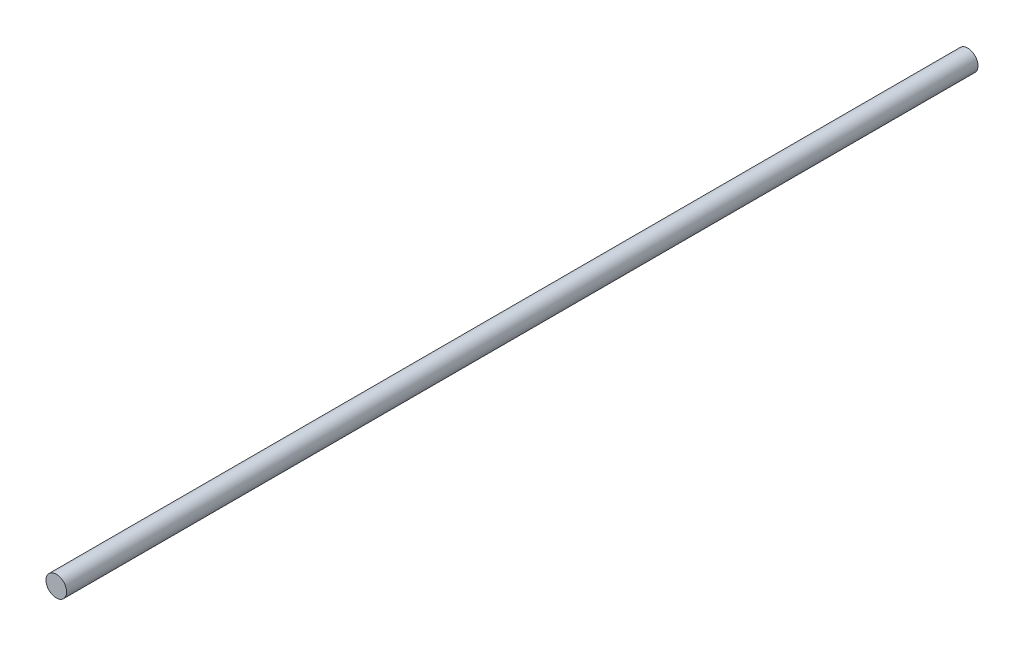
ISO-10303-21;
HEADER;
FILE_DESCRIPTION(('STEP AP214'),'2;1');
FILE_NAME('part.step','',(''),(''),'','','');
FILE_SCHEMA(('AUTOMOTIVE_DESIGN { 1 0 10303 214 1 1 1 1 }'));
ENDSEC;
DATA;
#1=APPLICATION_CONTEXT('core data for automotive mechanical design processes');
#2=APPLICATION_PROTOCOL_DEFINITION('international standard','automotive_design',2000,#1);
#3=PRODUCT_CONTEXT('',#1,'mechanical');
#4=PRODUCT('Part','Part','',(#3));
#5=PRODUCT_RELATED_PRODUCT_CATEGORY('part','',(#4));
#6=PRODUCT_DEFINITION_FORMATION('','',#4);
#7=PRODUCT_DEFINITION_CONTEXT('part definition',#1,'design');
#8=PRODUCT_DEFINITION('design','',#6,#7);
#9=PRODUCT_DEFINITION_SHAPE('','',#8);
#10=(LENGTH_UNIT() NAMED_UNIT(*) SI_UNIT(.MILLI.,.METRE.));
#11=(NAMED_UNIT(*) PLANE_ANGLE_UNIT() SI_UNIT($,.RADIAN.));
#12=(NAMED_UNIT(*) SI_UNIT($,.STERADIAN.) SOLID_ANGLE_UNIT());
#13=UNCERTAINTY_MEASURE_WITH_UNIT(LENGTH_MEASURE(1.E-05),#10,'distance_accuracy_value','');
#14=(GEOMETRIC_REPRESENTATION_CONTEXT(3) GLOBAL_UNCERTAINTY_ASSIGNED_CONTEXT((#13)) GLOBAL_UNIT_ASSIGNED_CONTEXT((#10,
#11,#12)) REPRESENTATION_CONTEXT('',''));
#15=CARTESIAN_POINT('',(0.,0.,0.));
#16=DIRECTION('',(0.,0.,1.));
#17=DIRECTION('',(1.,0.,0.));
#18=AXIS2_PLACEMENT_3D('',#15,#16,#17);
#19=CARTESIAN_POINT('',(0.,0.,177.));
#20=DIRECTION('',(0.,0.,-1.));
#21=DIRECTION('',(-1.,0.,0.));
#22=AXIS2_PLACEMENT_3D('',#19,#20,#21);
#23=CYLINDRICAL_SURFACE('',#22,4.);
#24=CARTESIAN_POINT('',(0.,0.,177.));
#25=DIRECTION('',(0.,0.,1.));
#26=DIRECTION('',(1.,0.,0.));
#27=AXIS2_PLACEMENT_3D('',#24,#25,#26);
#28=CIRCLE('',#27,4.);
#29=CARTESIAN_POINT('',(4.,0.,177.));
#30=VERTEX_POINT('',#29);
#31=EDGE_CURVE('E10',#30,#30,#28,.T.);
#32=ORIENTED_EDGE('',*,*,#31,.F.);
#33=EDGE_LOOP('',(#32));
#34=FACE_BOUND('',#33,.T.);
#35=CARTESIAN_POINT('',(0.,0.,-177.));
#36=DIRECTION('',(0.,0.,1.));
#37=DIRECTION('',(1.,0.,0.));
#38=AXIS2_PLACEMENT_3D('',#35,#36,#37);
#39=CIRCLE('',#38,4.);
#40=CARTESIAN_POINT('',(4.,0.,-177.));
#41=VERTEX_POINT('',#40);
#42=EDGE_CURVE('E46',#41,#41,#39,.T.);
#43=ORIENTED_EDGE('',*,*,#42,.T.);
#44=EDGE_LOOP('',(#43));
#45=FACE_BOUND('',#44,.T.);
#46=ADVANCED_FACE('F43',(#34,#45),#23,.T.);
#47=CARTESIAN_POINT('',(0.,0.,177.));
#48=DIRECTION('',(0.,0.,1.));
#49=DIRECTION('',(1.,0.,0.));
#50=AXIS2_PLACEMENT_3D('',#47,#48,#49);
#51=PLANE('',#50);
#52=ORIENTED_EDGE('',*,*,#31,.T.);
#53=EDGE_LOOP('',(#52));
#54=FACE_BOUND('',#53,.T.);
#55=ADVANCED_FACE('F58',(#54),#51,.T.);
#56=CARTESIAN_POINT('',(0.,0.,-177.));
#57=DIRECTION('',(0.,0.,1.));
#58=DIRECTION('',(1.,0.,0.));
#59=AXIS2_PLACEMENT_3D('',#56,#57,#58);
#60=PLANE('',#59);
#61=ORIENTED_EDGE('',*,*,#42,.F.);
#62=EDGE_LOOP('',(#61));
#63=FACE_BOUND('',#62,.T.);
#64=ADVANCED_FACE('F59',(#63),#60,.F.);
#65=CLOSED_SHELL('',(#46,#55,#64));
#66=MANIFOLD_SOLID_BREP('B2',#65);
#67=ADVANCED_BREP_SHAPE_REPRESENTATION('',(#18,#66),#14);
#68=SHAPE_DEFINITION_REPRESENTATION(#9,#67);
ENDSEC;
END-ISO-10303-21;
